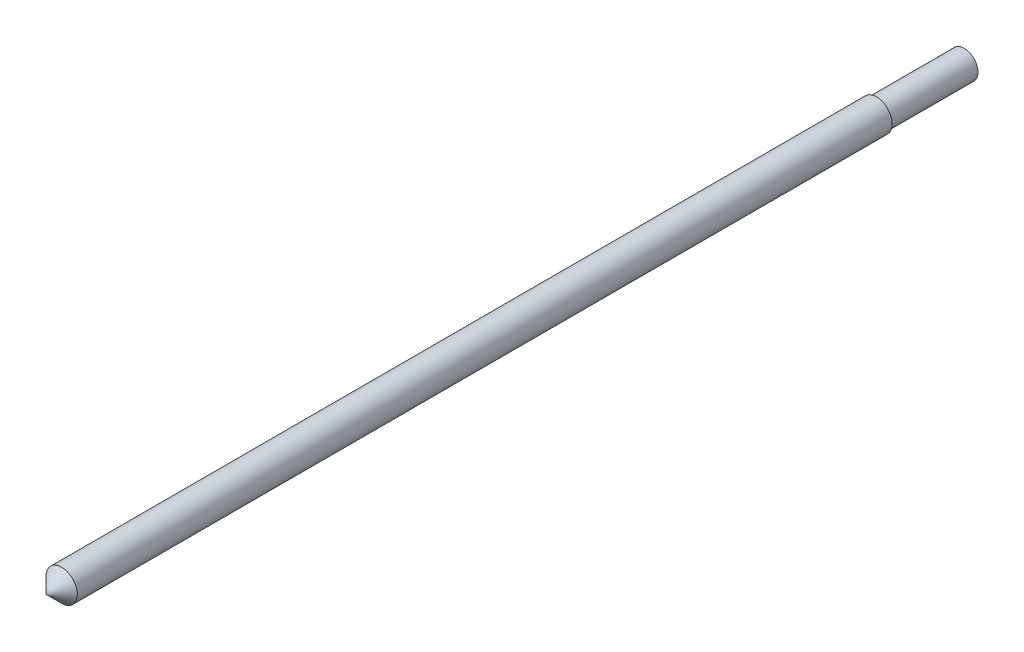
ISO-10303-21;
HEADER;
FILE_DESCRIPTION(('STEP AP214'),'2;1');
FILE_NAME('part.step','',(''),(''),'','','');
FILE_SCHEMA(('AUTOMOTIVE_DESIGN { 1 0 10303 214 1 1 1 1 }'));
ENDSEC;
DATA;
#1=APPLICATION_CONTEXT('core data for automotive mechanical design processes');
#2=APPLICATION_PROTOCOL_DEFINITION('international standard','automotive_design',2000,#1);
#3=PRODUCT_CONTEXT('',#1,'mechanical');
#4=PRODUCT('Part','Part','',(#3));
#5=PRODUCT_RELATED_PRODUCT_CATEGORY('part','',(#4));
#6=PRODUCT_DEFINITION_FORMATION('','',#4);
#7=PRODUCT_DEFINITION_CONTEXT('part definition',#1,'design');
#8=PRODUCT_DEFINITION('design','',#6,#7);
#9=PRODUCT_DEFINITION_SHAPE('','',#8);
#10=(LENGTH_UNIT() NAMED_UNIT(*) SI_UNIT(.MILLI.,.METRE.));
#11=(NAMED_UNIT(*) PLANE_ANGLE_UNIT() SI_UNIT($,.RADIAN.));
#12=(NAMED_UNIT(*) SI_UNIT($,.STERADIAN.) SOLID_ANGLE_UNIT());
#13=UNCERTAINTY_MEASURE_WITH_UNIT(LENGTH_MEASURE(1.E-05),#10,'distance_accuracy_value','');
#14=(GEOMETRIC_REPRESENTATION_CONTEXT(3) GLOBAL_UNCERTAINTY_ASSIGNED_CONTEXT((#13)) GLOBAL_UNIT_ASSIGNED_CONTEXT((#10,
#11,#12)) REPRESENTATION_CONTEXT('',''));
#15=CARTESIAN_POINT('',(0.,0.,0.));
#16=DIRECTION('',(0.,0.,1.));
#17=DIRECTION('',(1.,0.,0.));
#18=AXIS2_PLACEMENT_3D('',#15,#16,#17);
#19=CARTESIAN_POINT('',(0.,0.,650.));
#20=DIRECTION('',(0.,0.,-1.));
#21=DIRECTION('',(-1.,0.,0.));
#22=AXIS2_PLACEMENT_3D('',#19,#20,#21);
#23=CYLINDRICAL_SURFACE('',#22,12.5);
#24=CARTESIAN_POINT('',(0.,0.,650.));
#25=DIRECTION('',(0.,0.,1.));
#26=DIRECTION('',(1.,0.,0.));
#27=AXIS2_PLACEMENT_3D('',#24,#25,#26);
#28=CIRCLE('',#27,12.5);
#29=CARTESIAN_POINT('',(12.5,0.,650.));
#30=VERTEX_POINT('',#29);
#31=EDGE_CURVE('E47',#30,#30,#28,.T.);
#32=ORIENTED_EDGE('',*,*,#31,.F.);
#33=EDGE_LOOP('',(#32));
#34=FACE_BOUND('',#33,.T.);
#35=CARTESIAN_POINT('',(0.,0.,0.));
#36=DIRECTION('',(0.,0.,1.));
#37=DIRECTION('',(1.,0.,0.));
#38=AXIS2_PLACEMENT_3D('',#35,#36,#37);
#39=CIRCLE('',#38,12.5);
#40=CARTESIAN_POINT('',(12.5,0.,0.));
#41=VERTEX_POINT('',#40);
#42=EDGE_CURVE('E42',#41,#41,#39,.T.);
#43=ORIENTED_EDGE('',*,*,#42,.T.);
#44=EDGE_LOOP('',(#43));
#45=FACE_BOUND('',#44,.T.);
#46=ADVANCED_FACE('F39',(#34,#45),#23,.T.);
#47=CARTESIAN_POINT('',(0.,0.,0.));
#48=DIRECTION('',(0.,0.,1.));
#49=DIRECTION('',(1.,0.,0.));
#50=AXIS2_PLACEMENT_3D('',#47,#48,#49);
#51=PLANE('',#50);
#52=CARTESIAN_POINT('',(0.,0.,0.));
#53=DIRECTION('',(0.,0.,-1.));
#54=DIRECTION('',(-1.,0.,0.));
#55=AXIS2_PLACEMENT_3D('',#52,#53,#54);
#56=CIRCLE('',#55,11.);
#57=CARTESIAN_POINT('',(-11.,0.,0.));
#58=VERTEX_POINT('',#57);
#59=EDGE_CURVE('E11',#58,#58,#56,.T.);
#60=ORIENTED_EDGE('',*,*,#59,.F.);
#61=EDGE_LOOP('',(#60));
#62=FACE_BOUND('',#61,.T.);
#63=ORIENTED_EDGE('',*,*,#42,.F.);
#64=EDGE_LOOP('',(#63));
#65=FACE_BOUND('',#64,.T.);
#66=ADVANCED_FACE('F54',(#62,#65),#51,.F.);
#67=CARTESIAN_POINT('',(0.,0.,662.5));
#68=DIRECTION('',(0.,0.,-1.));
#69=DIRECTION('',(-1.,0.,0.));
#70=AXIS2_PLACEMENT_3D('',#67,#68,#69);
#71=CONICAL_SURFACE('',#70,0.,0.78539816339745);
#72=ORIENTED_EDGE('',*,*,#31,.T.);
#73=EDGE_LOOP('',(#72));
#74=FACE_BOUND('',#73,.T.);
#75=CARTESIAN_POINT('',(0.,0.,662.5));
#76=VERTEX_POINT('',#75);
#77=VERTEX_LOOP('',#76);
#78=FACE_BOUND('',#77,.T.);
#79=ADVANCED_FACE('F51',(#74,#78),#71,.T.);
#80=CARTESIAN_POINT('',(0.,0.,-70.));
#81=DIRECTION('',(0.,0.,1.));
#82=DIRECTION('',(1.,0.,0.));
#83=AXIS2_PLACEMENT_3D('',#80,#81,#82);
#84=CYLINDRICAL_SURFACE('',#83,11.);
#85=CARTESIAN_POINT('',(0.,0.,-70.));
#86=DIRECTION('',(0.,0.,-1.));
#87=DIRECTION('',(-1.,0.,0.));
#88=AXIS2_PLACEMENT_3D('',#85,#86,#87);
#89=CIRCLE('',#88,11.);
#90=CARTESIAN_POINT('',(-11.,0.,-70.));
#91=VERTEX_POINT('',#90);
#92=EDGE_CURVE('E76',#91,#91,#89,.T.);
#93=ORIENTED_EDGE('',*,*,#92,.F.);
#94=EDGE_LOOP('',(#93));
#95=FACE_BOUND('',#94,.T.);
#96=ORIENTED_EDGE('',*,*,#59,.T.);
#97=EDGE_LOOP('',(#96));
#98=FACE_BOUND('',#97,.T.);
#99=ADVANCED_FACE('F53',(#95,#98),#84,.T.);
#100=CARTESIAN_POINT('',(0.,0.,-70.));
#101=DIRECTION('',(0.,0.,-1.));
#102=DIRECTION('',(-1.,0.,0.));
#103=AXIS2_PLACEMENT_3D('',#100,#101,#102);
#104=PLANE('',#103);
#105=ORIENTED_EDGE('',*,*,#92,.T.);
#106=EDGE_LOOP('',(#105));
#107=FACE_BOUND('',#106,.T.);
#108=ADVANCED_FACE('F61',(#107),#104,.T.);
#109=CLOSED_SHELL('',(#46,#66,#79,#99,#108));
#110=MANIFOLD_SOLID_BREP('B2',#109);
#111=ADVANCED_BREP_SHAPE_REPRESENTATION('',(#18,#110),#14);
#112=SHAPE_DEFINITION_REPRESENTATION(#9,#111);
ENDSEC;
END-ISO-10303-21;
